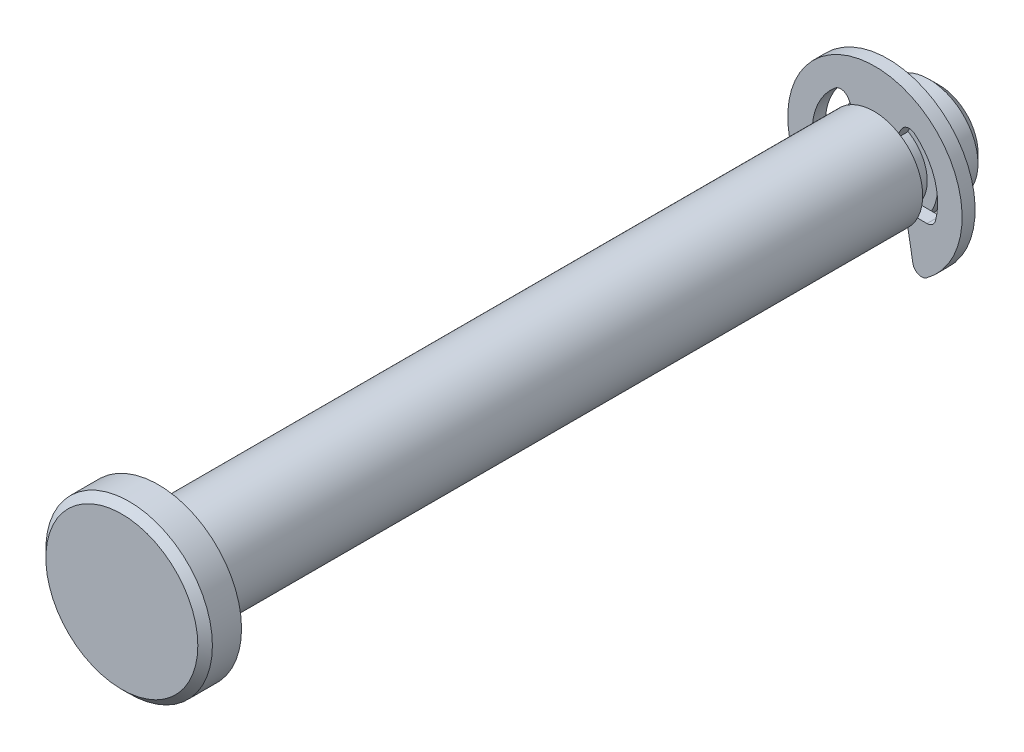
ISO-10303-21;
HEADER;
FILE_DESCRIPTION(('STEP AP214'),'2;1');
FILE_NAME('part.step','',(''),(''),'','','');
FILE_SCHEMA(('AUTOMOTIVE_DESIGN { 1 0 10303 214 1 1 1 1 }'));
ENDSEC;
DATA;
#1=APPLICATION_CONTEXT('core data for automotive mechanical design processes');
#2=APPLICATION_PROTOCOL_DEFINITION('international standard','automotive_design',2000,#1);
#3=PRODUCT_CONTEXT('',#1,'mechanical');
#4=PRODUCT('Part','Part','',(#3));
#5=PRODUCT_RELATED_PRODUCT_CATEGORY('part','',(#4));
#6=PRODUCT_DEFINITION_FORMATION('','',#4);
#7=PRODUCT_DEFINITION_CONTEXT('part definition',#1,'design');
#8=PRODUCT_DEFINITION('design','',#6,#7);
#9=PRODUCT_DEFINITION_SHAPE('','',#8);
#10=(LENGTH_UNIT() NAMED_UNIT(*) SI_UNIT(.MILLI.,.METRE.));
#11=(NAMED_UNIT(*) PLANE_ANGLE_UNIT() SI_UNIT($,.RADIAN.));
#12=(NAMED_UNIT(*) SI_UNIT($,.STERADIAN.) SOLID_ANGLE_UNIT());
#13=UNCERTAINTY_MEASURE_WITH_UNIT(LENGTH_MEASURE(1.E-05),#10,'distance_accuracy_value','');
#14=(GEOMETRIC_REPRESENTATION_CONTEXT(3) GLOBAL_UNCERTAINTY_ASSIGNED_CONTEXT((#13)) GLOBAL_UNIT_ASSIGNED_CONTEXT((#10,
#11,#12)) REPRESENTATION_CONTEXT('',''));
#15=CARTESIAN_POINT('',(0.,0.,0.));
#16=DIRECTION('',(0.,0.,1.));
#17=DIRECTION('',(1.,0.,0.));
#18=AXIS2_PLACEMENT_3D('',#15,#16,#17);
#19=CARTESIAN_POINT('',(0.,0.,-15.9258));
#20=DIRECTION('',(0.,0.,1.));
#21=DIRECTION('',(1.,0.,0.));
#22=AXIS2_PLACEMENT_3D('',#19,#20,#21);
#23=PLANE('',#22);
#24=DIRECTION('',(-0.173648177666931,0.984807753012208,0.));
#25=VECTOR('',#24,1.);
#26=CARTESIAN_POINT('',(1.25692963982568,0.22163060835344,-15.9258));
#27=LINE('',#26,#25);
#28=CARTESIAN_POINT('',(1.85256069501915,-3.15636096616503,-15.9258));
#29=VERTEX_POINT('',#28);
#30=CARTESIAN_POINT('',(1.49352,-1.12014,-15.9258));
#31=VERTEX_POINT('',#30);
#32=EDGE_CURVE('E195',#29,#31,#27,.T.);
#33=ORIENTED_EDGE('',*,*,#32,.F.);
#34=CARTESIAN_POINT('',(2.2715471535382,-3.08248234897663,-15.9258));
#35=DIRECTION('',(0.,0.,1.));
#36=DIRECTION('',(1.,0.,0.));
#37=AXIS2_PLACEMENT_3D('',#34,#35,#36);
#38=CIRCLE('',#37,0.42545);
#39=CARTESIAN_POINT('',(2.52394128170911,-3.42498038775182,-15.9258));
#40=VERTEX_POINT('',#39);
#41=EDGE_CURVE('E249',#29,#40,#38,.T.);
#42=ORIENTED_EDGE('',*,*,#41,.T.);
#43=CARTESIAN_POINT('',(0.,0.,-15.9258));
#44=DIRECTION('',(0.,0.,1.));
#45=DIRECTION('',(1.,0.,0.));
#46=AXIS2_PLACEMENT_3D('',#43,#44,#45);
#47=CIRCLE('',#46,4.2545);
#48=CARTESIAN_POINT('',(-2.52394128170911,-3.42498038775182,-15.9258));
#49=VERTEX_POINT('',#48);
#50=EDGE_CURVE('E175',#40,#49,#47,.T.);
#51=ORIENTED_EDGE('',*,*,#50,.T.);
#52=CARTESIAN_POINT('',(-2.2715471535382,-3.08248234897663,-15.9258));
#53=DIRECTION('',(0.,0.,1.));
#54=DIRECTION('',(1.,0.,0.));
#55=AXIS2_PLACEMENT_3D('',#52,#53,#54);
#56=CIRCLE('',#55,0.42545);
#57=CARTESIAN_POINT('',(-1.85256069501915,-3.15636096616503,-15.9258));
#58=VERTEX_POINT('',#57);
#59=EDGE_CURVE('E247',#49,#58,#56,.T.);
#60=ORIENTED_EDGE('',*,*,#59,.T.);
#61=DIRECTION('',(-0.173648177666931,-0.984807753012208,0.));
#62=VECTOR('',#61,1.);
#63=CARTESIAN_POINT('',(-1.25692963982568,0.22163060835344,-15.9258));
#64=LINE('',#63,#62);
#65=CARTESIAN_POINT('',(-1.49352,-1.12014,-15.9258));
#66=VERTEX_POINT('',#65);
#67=EDGE_CURVE('E191',#66,#58,#64,.T.);
#68=ORIENTED_EDGE('',*,*,#67,.F.);
#69=DIRECTION('',(1.,0.,0.));
#70=VECTOR('',#69,1.);
#71=CARTESIAN_POINT('',(0.,-1.12014,-15.9258));
#72=LINE('',#71,#70);
#73=CARTESIAN_POINT('',(-2.54203626378539,-1.12014,-15.9258));
#74=VERTEX_POINT('',#73);
#75=EDGE_CURVE('E182',#74,#66,#72,.T.);
#76=ORIENTED_EDGE('',*,*,#75,.F.);
#77=CARTESIAN_POINT('',(-2.54203626378539,-0.69469,-15.9258));
#78=DIRECTION('',(0.,0.,1.));
#79=DIRECTION('',(1.,0.,0.));
#80=AXIS2_PLACEMENT_3D('',#77,#78,#79);
#81=CIRCLE('',#80,0.42545);
#82=CARTESIAN_POINT('',(-2.95243729914352,-0.806844771084337,-15.9258));
#83=VERTEX_POINT('',#82);
#84=EDGE_CURVE('E47',#74,#83,#81,.F.);
#85=ORIENTED_EDGE('',*,*,#84,.T.);
#86=CARTESIAN_POINT('',(0.,0.,-15.9258));
#87=DIRECTION('',(0.,0.,1.));
#88=DIRECTION('',(1.,0.,0.));
#89=AXIS2_PLACEMENT_3D('',#86,#87,#88);
#90=CIRCLE('',#89,3.0607);
#91=CARTESIAN_POINT('',(-1.93820951958955,2.36880314677528,-15.9258));
#92=VERTEX_POINT('',#91);
#93=EDGE_CURVE('E207',#92,#83,#90,.T.);
#94=ORIENTED_EDGE('',*,*,#93,.F.);
#95=CARTESIAN_POINT('',(-1.66879035400345,2.03952968031481,-15.9258));
#96=DIRECTION('',(0.,0.,1.));
#97=DIRECTION('',(1.,0.,0.));
#98=AXIS2_PLACEMENT_3D('',#95,#96,#97);
#99=CIRCLE('',#98,0.42545);
#100=CARTESIAN_POINT('',(-1.30033984596336,2.25225468031482,-15.9258));
#101=VERTEX_POINT('',#100);
#102=EDGE_CURVE('E179',#92,#101,#99,.F.);
#103=ORIENTED_EDGE('',*,*,#102,.T.);
#104=DIRECTION('',(-0.500000000000002,0.866025403784438,0.));
#105=VECTOR('',#104,1.);
#106=CARTESIAN_POINT('',(0.,0.,-15.9258));
#107=LINE('',#106,#105);
#108=CARTESIAN_POINT('',(-0.933450000000003,1.61678282632517,-15.9258));
#109=VERTEX_POINT('',#108);
#110=EDGE_CURVE('E171',#109,#101,#107,.T.);
#111=ORIENTED_EDGE('',*,*,#110,.F.);
#112=DIRECTION('',(1.,0.,0.));
#113=VECTOR('',#112,1.);
#114=CARTESIAN_POINT('',(-0.933450000000003,1.61678282632517,-15.9258));
#115=LINE('',#114,#113);
#116=CARTESIAN_POINT('',(0.933450000000003,1.61678282632517,-15.9258));
#117=VERTEX_POINT('',#116);
#118=EDGE_CURVE('E155',#109,#117,#115,.T.);
#119=ORIENTED_EDGE('',*,*,#118,.T.);
#120=DIRECTION('',(-0.500000000000002,-0.866025403784438,0.));
#121=VECTOR('',#120,1.);
#122=CARTESIAN_POINT('',(0.,0.,-15.9258));
#123=LINE('',#122,#121);
#124=CARTESIAN_POINT('',(1.30033984596336,2.25225468031482,-15.9258));
#125=VERTEX_POINT('',#124);
#126=EDGE_CURVE('E205',#125,#117,#123,.T.);
#127=ORIENTED_EDGE('',*,*,#126,.F.);
#128=CARTESIAN_POINT('',(1.66879035400345,2.03952968031481,-15.9258));
#129=DIRECTION('',(0.,0.,1.));
#130=DIRECTION('',(1.,0.,0.));
#131=AXIS2_PLACEMENT_3D('',#128,#129,#130);
#132=CIRCLE('',#131,0.42545);
#133=CARTESIAN_POINT('',(1.93820951958955,2.36880314677528,-15.9258));
#134=VERTEX_POINT('',#133);
#135=EDGE_CURVE('E264',#125,#134,#132,.F.);
#136=ORIENTED_EDGE('',*,*,#135,.T.);
#137=CARTESIAN_POINT('',(0.,0.,-15.9258));
#138=DIRECTION('',(0.,0.,1.));
#139=DIRECTION('',(1.,0.,0.));
#140=AXIS2_PLACEMENT_3D('',#137,#138,#139);
#141=CIRCLE('',#140,3.0607);
#142=CARTESIAN_POINT('',(2.95243729914352,-0.806844771084337,-15.9258));
#143=VERTEX_POINT('',#142);
#144=EDGE_CURVE('E210',#143,#134,#141,.T.);
#145=ORIENTED_EDGE('',*,*,#144,.F.);
#146=CARTESIAN_POINT('',(2.54203626378539,-0.69469,-15.9258));
#147=DIRECTION('',(0.,0.,1.));
#148=DIRECTION('',(1.,0.,0.));
#149=AXIS2_PLACEMENT_3D('',#146,#147,#148);
#150=CIRCLE('',#149,0.42545);
#151=CARTESIAN_POINT('',(2.54203626378539,-1.12014,-15.9258));
#152=VERTEX_POINT('',#151);
#153=EDGE_CURVE('E260',#143,#152,#150,.F.);
#154=ORIENTED_EDGE('',*,*,#153,.T.);
#155=DIRECTION('',(1.,0.,0.));
#156=VECTOR('',#155,1.);
#157=CARTESIAN_POINT('',(0.,-1.12014,-15.9258));
#158=LINE('',#157,#156);
#159=EDGE_CURVE('E200',#31,#152,#158,.T.);
#160=ORIENTED_EDGE('',*,*,#159,.F.);
#161=EDGE_LOOP('',(#33,#42,#51,#60,#68,#76,#85,#94,#103,#111,#119,#127,#136,#145,#154,#160));
#162=FACE_BOUND('',#161,.T.);
#163=ADVANCED_FACE('F39',(#162),#23,.T.);
#164=CARTESIAN_POINT('',(0.,0.,-16.5608));
#165=DIRECTION('',(0.,0.,1.));
#166=DIRECTION('',(1.,0.,0.));
#167=AXIS2_PLACEMENT_3D('',#164,#165,#166);
#168=PLANE('',#167);
#169=CARTESIAN_POINT('',(0.,0.,-16.5608));
#170=DIRECTION('',(0.,0.,1.));
#171=DIRECTION('',(1.,0.,0.));
#172=AXIS2_PLACEMENT_3D('',#169,#170,#171);
#173=CIRCLE('',#172,4.2545);
#174=CARTESIAN_POINT('',(2.52394128170911,-3.42498038775182,-16.5608));
#175=VERTEX_POINT('',#174);
#176=CARTESIAN_POINT('',(-2.52394128170911,-3.42498038775182,-16.5608));
#177=VERTEX_POINT('',#176);
#178=EDGE_CURVE('E213',#175,#177,#173,.T.);
#179=ORIENTED_EDGE('',*,*,#178,.F.);
#180=CARTESIAN_POINT('',(2.2715471535382,-3.08248234897663,-16.5608));
#181=DIRECTION('',(0.,0.,1.));
#182=DIRECTION('',(1.,0.,0.));
#183=AXIS2_PLACEMENT_3D('',#180,#181,#182);
#184=CIRCLE('',#183,0.42545);
#185=CARTESIAN_POINT('',(1.85256069501915,-3.15636096616503,-16.5608));
#186=VERTEX_POINT('',#185);
#187=EDGE_CURVE('E257',#175,#186,#184,.F.);
#188=ORIENTED_EDGE('',*,*,#187,.T.);
#189=DIRECTION('',(-0.173648177666931,0.984807753012208,0.));
#190=VECTOR('',#189,1.);
#191=CARTESIAN_POINT('',(1.25692963982568,0.22163060835344,-16.5608));
#192=LINE('',#191,#190);
#193=CARTESIAN_POINT('',(1.49352,-1.12014,-16.5608));
#194=VERTEX_POINT('',#193);
#195=EDGE_CURVE('E193',#186,#194,#192,.T.);
#196=ORIENTED_EDGE('',*,*,#195,.T.);
#197=DIRECTION('',(1.,0.,0.));
#198=VECTOR('',#197,1.);
#199=CARTESIAN_POINT('',(0.,-1.12014,-16.5608));
#200=LINE('',#199,#198);
#201=CARTESIAN_POINT('',(2.54203626378539,-1.12014,-16.5608));
#202=VERTEX_POINT('',#201);
#203=EDGE_CURVE('E197',#194,#202,#200,.T.);
#204=ORIENTED_EDGE('',*,*,#203,.T.);
#205=CARTESIAN_POINT('',(2.54203626378539,-0.69469,-16.5608));
#206=DIRECTION('',(0.,0.,1.));
#207=DIRECTION('',(1.,0.,0.));
#208=AXIS2_PLACEMENT_3D('',#205,#206,#207);
#209=CIRCLE('',#208,0.42545);
#210=CARTESIAN_POINT('',(2.95243729914352,-0.806844771084337,-16.5608));
#211=VERTEX_POINT('',#210);
#212=EDGE_CURVE('E262',#202,#211,#209,.T.);
#213=ORIENTED_EDGE('',*,*,#212,.T.);
#214=CARTESIAN_POINT('',(0.,0.,-16.5608));
#215=DIRECTION('',(0.,0.,1.));
#216=DIRECTION('',(1.,0.,0.));
#217=AXIS2_PLACEMENT_3D('',#214,#215,#216);
#218=CIRCLE('',#217,3.0607);
#219=CARTESIAN_POINT('',(1.93820951958955,2.36880314677528,-16.5608));
#220=VERTEX_POINT('',#219);
#221=EDGE_CURVE('E221',#211,#220,#218,.T.);
#222=ORIENTED_EDGE('',*,*,#221,.T.);
#223=CARTESIAN_POINT('',(1.66879035400345,2.03952968031481,-16.5608));
#224=DIRECTION('',(0.,0.,1.));
#225=DIRECTION('',(1.,0.,0.));
#226=AXIS2_PLACEMENT_3D('',#223,#224,#225);
#227=CIRCLE('',#226,0.42545);
#228=CARTESIAN_POINT('',(1.30033984596336,2.25225468031482,-16.5608));
#229=VERTEX_POINT('',#228);
#230=EDGE_CURVE('E266',#220,#229,#227,.T.);
#231=ORIENTED_EDGE('',*,*,#230,.T.);
#232=DIRECTION('',(-0.500000000000002,-0.866025403784438,0.));
#233=VECTOR('',#232,1.);
#234=CARTESIAN_POINT('',(0.,0.,-16.5608));
#235=LINE('',#234,#233);
#236=CARTESIAN_POINT('',(0.933450000000003,1.61678282632517,-16.5608));
#237=VERTEX_POINT('',#236);
#238=EDGE_CURVE('E203',#229,#237,#235,.T.);
#239=ORIENTED_EDGE('',*,*,#238,.T.);
#240=DIRECTION('',(-1.,0.,0.));
#241=VECTOR('',#240,1.);
#242=CARTESIAN_POINT('',(-0.933450000000003,1.61678282632517,-16.5608));
#243=LINE('',#242,#241);
#244=CARTESIAN_POINT('',(-0.933450000000003,1.61678282632517,-16.5608));
#245=VERTEX_POINT('',#244);
#246=EDGE_CURVE('E166',#237,#245,#243,.T.);
#247=ORIENTED_EDGE('',*,*,#246,.T.);
#248=DIRECTION('',(-0.500000000000002,0.866025403784438,0.));
#249=VECTOR('',#248,1.);
#250=CARTESIAN_POINT('',(0.,0.,-16.5608));
#251=LINE('',#250,#249);
#252=CARTESIAN_POINT('',(-1.30033984596336,2.25225468031482,-16.5608));
#253=VERTEX_POINT('',#252);
#254=EDGE_CURVE('E174',#245,#253,#251,.T.);
#255=ORIENTED_EDGE('',*,*,#254,.T.);
#256=CARTESIAN_POINT('',(-1.66879035400345,2.03952968031481,-16.5608));
#257=DIRECTION('',(0.,0.,1.));
#258=DIRECTION('',(1.,0.,0.));
#259=AXIS2_PLACEMENT_3D('',#256,#257,#258);
#260=CIRCLE('',#259,0.42545);
#261=CARTESIAN_POINT('',(-1.93820951958955,2.36880314677528,-16.5608));
#262=VERTEX_POINT('',#261);
#263=EDGE_CURVE('E269',#253,#262,#260,.T.);
#264=ORIENTED_EDGE('',*,*,#263,.T.);
#265=CARTESIAN_POINT('',(0.,0.,-16.5608));
#266=DIRECTION('',(0.,0.,1.));
#267=DIRECTION('',(1.,0.,0.));
#268=AXIS2_PLACEMENT_3D('',#265,#266,#267);
#269=CIRCLE('',#268,3.0607);
#270=CARTESIAN_POINT('',(-2.95243729914352,-0.806844771084337,-16.5608));
#271=VERTEX_POINT('',#270);
#272=EDGE_CURVE('E218',#262,#271,#269,.T.);
#273=ORIENTED_EDGE('',*,*,#272,.T.);
#274=CARTESIAN_POINT('',(-2.54203626378539,-0.69469,-16.5608));
#275=DIRECTION('',(0.,0.,1.));
#276=DIRECTION('',(1.,0.,0.));
#277=AXIS2_PLACEMENT_3D('',#274,#275,#276);
#278=CIRCLE('',#277,0.42545);
#279=CARTESIAN_POINT('',(-2.54203626378539,-1.12014,-16.5608));
#280=VERTEX_POINT('',#279);
#281=EDGE_CURVE('E12',#271,#280,#278,.T.);
#282=ORIENTED_EDGE('',*,*,#281,.T.);
#283=DIRECTION('',(1.,0.,0.));
#284=VECTOR('',#283,1.);
#285=CARTESIAN_POINT('',(0.,-1.12014,-16.5608));
#286=LINE('',#285,#284);
#287=CARTESIAN_POINT('',(-1.49352,-1.12014,-16.5608));
#288=VERTEX_POINT('',#287);
#289=EDGE_CURVE('E180',#280,#288,#286,.T.);
#290=ORIENTED_EDGE('',*,*,#289,.T.);
#291=DIRECTION('',(-0.173648177666931,-0.984807753012208,0.));
#292=VECTOR('',#291,1.);
#293=CARTESIAN_POINT('',(-1.25692963982568,0.22163060835344,-16.5608));
#294=LINE('',#293,#292);
#295=CARTESIAN_POINT('',(-1.85256069501915,-3.15636096616503,-16.5608));
#296=VERTEX_POINT('',#295);
#297=EDGE_CURVE('E189',#288,#296,#294,.T.);
#298=ORIENTED_EDGE('',*,*,#297,.T.);
#299=CARTESIAN_POINT('',(-2.2715471535382,-3.08248234897663,-16.5608));
#300=DIRECTION('',(0.,0.,1.));
#301=DIRECTION('',(1.,0.,0.));
#302=AXIS2_PLACEMENT_3D('',#299,#300,#301);
#303=CIRCLE('',#302,0.42545);
#304=EDGE_CURVE('E61',#296,#177,#303,.F.);
#305=ORIENTED_EDGE('',*,*,#304,.T.);
#306=EDGE_LOOP('',(#179,#188,#196,#204,#213,#222,#231,#239,#247,#255,#264,#273,#282,#290,#298,#305));
#307=FACE_BOUND('',#306,.T.);
#308=ADVANCED_FACE('F282',(#307),#168,.F.);
#309=CARTESIAN_POINT('',(0.,0.,-15.9258));
#310=DIRECTION('',(0.,0.,-1.));
#311=DIRECTION('',(-1.,0.,0.));
#312=AXIS2_PLACEMENT_3D('',#309,#310,#311);
#313=CYLINDRICAL_SURFACE('',#312,4.2545);
#314=ORIENTED_EDGE('',*,*,#50,.F.);
#315=DIRECTION('',(0.,0.,-1.));
#316=VECTOR('',#315,1.);
#317=CARTESIAN_POINT('',(2.52394128170911,-3.42498038775182,-15.9258));
#318=LINE('',#317,#316);
#319=EDGE_CURVE('E254',#40,#175,#318,.T.);
#320=ORIENTED_EDGE('',*,*,#319,.T.);
#321=ORIENTED_EDGE('',*,*,#178,.T.);
#322=DIRECTION('',(0.,0.,-1.));
#323=VECTOR('',#322,1.);
#324=CARTESIAN_POINT('',(-2.52394128170911,-3.42498038775182,-15.9258));
#325=LINE('',#324,#323);
#326=EDGE_CURVE('E251',#177,#49,#325,.F.);
#327=ORIENTED_EDGE('',*,*,#326,.T.);
#328=EDGE_LOOP('',(#314,#320,#321,#327));
#329=FACE_BOUND('',#328,.T.);
#330=ADVANCED_FACE('F322',(#329),#313,.T.);
#331=CARTESIAN_POINT('',(-1.49352,-1.12014,-19.05));
#332=DIRECTION('',(-0.984807753012208,0.173648177666931,0.));
#333=DIRECTION('',(-0.173648177666931,-0.984807753012208,0.));
#334=AXIS2_PLACEMENT_3D('',#331,#332,#333);
#335=PLANE('',#334);
#336=ORIENTED_EDGE('',*,*,#67,.T.);
#337=DIRECTION('',(0.,0.,-1.));
#338=VECTOR('',#337,1.);
#339=CARTESIAN_POINT('',(-1.85256069501915,-3.15636096616503,-19.05));
#340=LINE('',#339,#338);
#341=EDGE_CURVE('E54',#58,#296,#340,.T.);
#342=ORIENTED_EDGE('',*,*,#341,.T.);
#343=ORIENTED_EDGE('',*,*,#297,.F.);
#344=DIRECTION('',(0.,0.,1.));
#345=VECTOR('',#344,1.);
#346=CARTESIAN_POINT('',(-1.49352,-1.12014,-19.05));
#347=LINE('',#346,#345);
#348=EDGE_CURVE('E287',#288,#66,#347,.T.);
#349=ORIENTED_EDGE('',*,*,#348,.T.);
#350=EDGE_LOOP('',(#336,#342,#343,#349));
#351=FACE_BOUND('',#350,.T.);
#352=ADVANCED_FACE('F327',(#351),#335,.F.);
#353=CARTESIAN_POINT('',(-1.53035,2.65064395336303,-19.05));
#354=DIRECTION('',(0.866025403784438,0.500000000000002,0.));
#355=DIRECTION('',(-0.500000000000002,0.866025403784438,0.));
#356=AXIS2_PLACEMENT_3D('',#353,#354,#355);
#357=PLANE('',#356);
#358=ORIENTED_EDGE('',*,*,#110,.T.);
#359=DIRECTION('',(0.,0.,-1.));
#360=VECTOR('',#359,1.);
#361=CARTESIAN_POINT('',(-1.30033984596336,2.25225468031481,-16.5608));
#362=LINE('',#361,#360);
#363=EDGE_CURVE('E239',#101,#253,#362,.T.);
#364=ORIENTED_EDGE('',*,*,#363,.T.);
#365=ORIENTED_EDGE('',*,*,#254,.F.);
#366=DIRECTION('',(0.,0.,-1.));
#367=VECTOR('',#366,1.);
#368=CARTESIAN_POINT('',(-0.933450000000003,1.61678282632517,-15.9258));
#369=LINE('',#368,#367);
#370=EDGE_CURVE('E159',#245,#109,#369,.F.);
#371=ORIENTED_EDGE('',*,*,#370,.T.);
#372=EDGE_LOOP('',(#358,#364,#365,#371));
#373=FACE_BOUND('',#372,.T.);
#374=ADVANCED_FACE('F170',(#373),#357,.F.);
#375=CARTESIAN_POINT('',(0.,0.,-19.05));
#376=DIRECTION('',(0.,0.,1.));
#377=DIRECTION('',(1.,0.,0.));
#378=AXIS2_PLACEMENT_3D('',#375,#376,#377);
#379=CYLINDRICAL_SURFACE('',#378,3.0607);
#380=ORIENTED_EDGE('',*,*,#272,.F.);
#381=DIRECTION('',(0.,0.,1.));
#382=VECTOR('',#381,1.);
#383=CARTESIAN_POINT('',(-1.93820951958955,2.36880314677528,-19.05));
#384=LINE('',#383,#382);
#385=EDGE_CURVE('E236',#262,#92,#384,.T.);
#386=ORIENTED_EDGE('',*,*,#385,.T.);
#387=ORIENTED_EDGE('',*,*,#93,.T.);
#388=DIRECTION('',(0.,0.,1.));
#389=VECTOR('',#388,1.);
#390=CARTESIAN_POINT('',(-2.95243729914352,-0.806844771084337,-19.05));
#391=LINE('',#390,#389);
#392=EDGE_CURVE('E234',#83,#271,#391,.F.);
#393=ORIENTED_EDGE('',*,*,#392,.T.);
#394=EDGE_LOOP('',(#380,#386,#387,#393));
#395=FACE_BOUND('',#394,.T.);
#396=ADVANCED_FACE('F277',(#395),#379,.F.);
#397=CARTESIAN_POINT('',(-2.84836284036989,-1.12014,-19.05));
#398=DIRECTION('',(0.,-1.,0.));
#399=DIRECTION('',(0.,0.,-1.));
#400=AXIS2_PLACEMENT_3D('',#397,#398,#399);
#401=PLANE('',#400);
#402=ORIENTED_EDGE('',*,*,#289,.F.);
#403=DIRECTION('',(0.,0.,-1.));
#404=VECTOR('',#403,1.);
#405=CARTESIAN_POINT('',(-2.54203626378539,-1.12014,-15.9258));
#406=LINE('',#405,#404);
#407=EDGE_CURVE('E241',#280,#74,#406,.F.);
#408=ORIENTED_EDGE('',*,*,#407,.T.);
#409=ORIENTED_EDGE('',*,*,#75,.T.);
#410=ORIENTED_EDGE('',*,*,#348,.F.);
#411=EDGE_LOOP('',(#402,#408,#409,#410));
#412=FACE_BOUND('',#411,.T.);
#413=ADVANCED_FACE('F285',(#412),#401,.F.);
#414=CARTESIAN_POINT('',(0.,0.,-19.05));
#415=DIRECTION('',(0.,0.,1.));
#416=DIRECTION('',(1.,0.,0.));
#417=AXIS2_PLACEMENT_3D('',#414,#415,#416);
#418=CYLINDRICAL_SURFACE('',#417,3.0607);
#419=ORIENTED_EDGE('',*,*,#221,.F.);
#420=DIRECTION('',(0.,0.,1.));
#421=VECTOR('',#420,1.);
#422=CARTESIAN_POINT('',(2.95243729914352,-0.806844771084337,-19.05));
#423=LINE('',#422,#421);
#424=EDGE_CURVE('E226',#211,#143,#423,.T.);
#425=ORIENTED_EDGE('',*,*,#424,.T.);
#426=ORIENTED_EDGE('',*,*,#144,.T.);
#427=DIRECTION('',(0.,0.,1.));
#428=VECTOR('',#427,1.);
#429=CARTESIAN_POINT('',(1.93820951958955,2.36880314677528,-19.05));
#430=LINE('',#429,#428);
#431=EDGE_CURVE('E224',#134,#220,#430,.F.);
#432=ORIENTED_EDGE('',*,*,#431,.T.);
#433=EDGE_LOOP('',(#419,#425,#426,#432));
#434=FACE_BOUND('',#433,.T.);
#435=ADVANCED_FACE('F301',(#434),#418,.F.);
#436=CARTESIAN_POINT('',(1.49352,-1.12014,-19.05));
#437=DIRECTION('',(0.,-1.,0.));
#438=DIRECTION('',(0.,0.,-1.));
#439=AXIS2_PLACEMENT_3D('',#436,#437,#438);
#440=PLANE('',#439);
#441=ORIENTED_EDGE('',*,*,#159,.T.);
#442=DIRECTION('',(0.,0.,-1.));
#443=VECTOR('',#442,1.);
#444=CARTESIAN_POINT('',(2.54203626378539,-1.12014,-16.5608));
#445=LINE('',#444,#443);
#446=EDGE_CURVE('E229',#152,#202,#445,.T.);
#447=ORIENTED_EDGE('',*,*,#446,.T.);
#448=ORIENTED_EDGE('',*,*,#203,.F.);
#449=DIRECTION('',(0.,0.,1.));
#450=VECTOR('',#449,1.);
#451=CARTESIAN_POINT('',(1.49352,-1.12014,-19.05));
#452=LINE('',#451,#450);
#453=EDGE_CURVE('E184',#194,#31,#452,.T.);
#454=ORIENTED_EDGE('',*,*,#453,.T.);
#455=EDGE_LOOP('',(#441,#447,#448,#454));
#456=FACE_BOUND('',#455,.T.);
#457=ADVANCED_FACE('F311',(#456),#440,.F.);
#458=CARTESIAN_POINT('',(1.49352,-1.12014,-19.05));
#459=DIRECTION('',(0.984807753012208,0.173648177666931,0.));
#460=DIRECTION('',(-0.173648177666931,0.984807753012208,0.));
#461=AXIS2_PLACEMENT_3D('',#458,#459,#460);
#462=PLANE('',#461);
#463=ORIENTED_EDGE('',*,*,#195,.F.);
#464=DIRECTION('',(0.,0.,-1.));
#465=VECTOR('',#464,1.);
#466=CARTESIAN_POINT('',(1.85256069501915,-3.15636096616503,-19.05));
#467=LINE('',#466,#465);
#468=EDGE_CURVE('E244',#186,#29,#467,.F.);
#469=ORIENTED_EDGE('',*,*,#468,.T.);
#470=ORIENTED_EDGE('',*,*,#32,.T.);
#471=ORIENTED_EDGE('',*,*,#453,.F.);
#472=EDGE_LOOP('',(#463,#469,#470,#471));
#473=FACE_BOUND('',#472,.T.);
#474=ADVANCED_FACE('F316',(#473),#462,.F.);
#475=CARTESIAN_POINT('',(0.,0.,-19.05));
#476=DIRECTION('',(-0.866025403784438,0.500000000000002,0.));
#477=DIRECTION('',(-0.500000000000002,-0.866025403784438,0.));
#478=AXIS2_PLACEMENT_3D('',#475,#476,#477);
#479=PLANE('',#478);
#480=ORIENTED_EDGE('',*,*,#238,.F.);
#481=DIRECTION('',(0.,0.,-1.));
#482=VECTOR('',#481,1.);
#483=CARTESIAN_POINT('',(1.30033984596336,2.25225468031481,-15.9258));
#484=LINE('',#483,#482);
#485=EDGE_CURVE('E231',#229,#125,#484,.F.);
#486=ORIENTED_EDGE('',*,*,#485,.T.);
#487=ORIENTED_EDGE('',*,*,#126,.T.);
#488=DIRECTION('',(0.,0.,-1.));
#489=VECTOR('',#488,1.);
#490=CARTESIAN_POINT('',(0.933450000000003,1.61678282632517,-15.9258));
#491=LINE('',#490,#489);
#492=EDGE_CURVE('E162',#117,#237,#491,.T.);
#493=ORIENTED_EDGE('',*,*,#492,.T.);
#494=EDGE_LOOP('',(#480,#486,#487,#493));
#495=FACE_BOUND('',#494,.T.);
#496=ADVANCED_FACE('F294',(#495),#479,.F.);
#497=CARTESIAN_POINT('',(-0.933450000000003,1.61678282632517,-18.4443801577228));
#498=DIRECTION('',(0.,-1.,0.));
#499=DIRECTION('',(0.,0.,-1.));
#500=AXIS2_PLACEMENT_3D('',#497,#498,#499);
#501=PLANE('',#500);
#502=ORIENTED_EDGE('',*,*,#246,.F.);
#503=ORIENTED_EDGE('',*,*,#492,.F.);
#504=ORIENTED_EDGE('',*,*,#118,.F.);
#505=ORIENTED_EDGE('',*,*,#370,.F.);
#506=EDGE_LOOP('',(#502,#503,#504,#505));
#507=FACE_BOUND('',#506,.T.);
#508=ADVANCED_FACE('F158',(#507),#501,.T.);
#509=CARTESIAN_POINT('',(2.54203626378539,-0.69469,-19.05));
#510=DIRECTION('',(0.,0.,1.));
#511=DIRECTION('',(1.,0.,0.));
#512=AXIS2_PLACEMENT_3D('',#509,#510,#511);
#513=CYLINDRICAL_SURFACE('',#512,0.42545);
#514=ORIENTED_EDGE('',*,*,#212,.F.);
#515=ORIENTED_EDGE('',*,*,#446,.F.);
#516=ORIENTED_EDGE('',*,*,#153,.F.);
#517=ORIENTED_EDGE('',*,*,#424,.F.);
#518=EDGE_LOOP('',(#514,#515,#516,#517));
#519=FACE_BOUND('',#518,.T.);
#520=ADVANCED_FACE('F307',(#519),#513,.F.);
#521=CARTESIAN_POINT('',(1.66879035400345,2.03952968031481,-19.05));
#522=DIRECTION('',(0.,0.,1.));
#523=DIRECTION('',(1.,0.,0.));
#524=AXIS2_PLACEMENT_3D('',#521,#522,#523);
#525=CYLINDRICAL_SURFACE('',#524,0.42545);
#526=ORIENTED_EDGE('',*,*,#230,.F.);
#527=ORIENTED_EDGE('',*,*,#431,.F.);
#528=ORIENTED_EDGE('',*,*,#135,.F.);
#529=ORIENTED_EDGE('',*,*,#485,.F.);
#530=EDGE_LOOP('',(#526,#527,#528,#529));
#531=FACE_BOUND('',#530,.T.);
#532=ADVANCED_FACE('F304',(#531),#525,.F.);
#533=CARTESIAN_POINT('',(-1.66879035400345,2.03952968031481,-19.05));
#534=DIRECTION('',(0.,0.,1.));
#535=DIRECTION('',(1.,0.,0.));
#536=AXIS2_PLACEMENT_3D('',#533,#534,#535);
#537=CYLINDRICAL_SURFACE('',#536,0.42545);
#538=ORIENTED_EDGE('',*,*,#263,.F.);
#539=ORIENTED_EDGE('',*,*,#363,.F.);
#540=ORIENTED_EDGE('',*,*,#102,.F.);
#541=ORIENTED_EDGE('',*,*,#385,.F.);
#542=EDGE_LOOP('',(#538,#539,#540,#541));
#543=FACE_BOUND('',#542,.T.);
#544=ADVANCED_FACE('F350',(#543),#537,.F.);
#545=CARTESIAN_POINT('',(-2.54203626378539,-0.69469,-19.05));
#546=DIRECTION('',(0.,0.,1.));
#547=DIRECTION('',(1.,0.,0.));
#548=AXIS2_PLACEMENT_3D('',#545,#546,#547);
#549=CYLINDRICAL_SURFACE('',#548,0.42545);
#550=ORIENTED_EDGE('',*,*,#281,.F.);
#551=ORIENTED_EDGE('',*,*,#392,.F.);
#552=ORIENTED_EDGE('',*,*,#84,.F.);
#553=ORIENTED_EDGE('',*,*,#407,.F.);
#554=EDGE_LOOP('',(#550,#551,#552,#553));
#555=FACE_BOUND('',#554,.T.);
#556=ADVANCED_FACE('F280',(#555),#549,.F.);
#557=CARTESIAN_POINT('',(2.2715471535382,-3.08248234897663,-15.9258));
#558=DIRECTION('',(0.,0.,-1.));
#559=DIRECTION('',(-1.,0.,0.));
#560=AXIS2_PLACEMENT_3D('',#557,#558,#559);
#561=CYLINDRICAL_SURFACE('',#560,0.42545);
#562=ORIENTED_EDGE('',*,*,#187,.F.);
#563=ORIENTED_EDGE('',*,*,#319,.F.);
#564=ORIENTED_EDGE('',*,*,#41,.F.);
#565=ORIENTED_EDGE('',*,*,#468,.F.);
#566=EDGE_LOOP('',(#562,#563,#564,#565));
#567=FACE_BOUND('',#566,.T.);
#568=ADVANCED_FACE('F325',(#567),#561,.T.);
#569=CARTESIAN_POINT('',(-2.2715471535382,-3.08248234897663,-15.9258));
#570=DIRECTION('',(0.,0.,-1.));
#571=DIRECTION('',(-1.,0.,0.));
#572=AXIS2_PLACEMENT_3D('',#569,#570,#571);
#573=CYLINDRICAL_SURFACE('',#572,0.42545);
#574=ORIENTED_EDGE('',*,*,#304,.F.);
#575=ORIENTED_EDGE('',*,*,#341,.F.);
#576=ORIENTED_EDGE('',*,*,#59,.F.);
#577=ORIENTED_EDGE('',*,*,#326,.F.);
#578=EDGE_LOOP('',(#574,#575,#576,#577));
#579=FACE_BOUND('',#578,.T.);
#580=ADVANCED_FACE('F41',(#579),#573,.T.);
#581=CLOSED_SHELL('',(#163,#308,#330,#352,#374,#396,#413,#435,#457,#474,#496,#508,#520,#532,
#544,#556,#568,#580));
#582=MANIFOLD_SOLID_BREP('B2',#581);
#583=CARTESIAN_POINT('',(0.,0.,19.05));
#584=DIRECTION('',(0.,0.,-1.));
#585=DIRECTION('',(-1.,0.,0.));
#586=AXIS2_PLACEMENT_3D('',#583,#584,#585);
#587=CYLINDRICAL_SURFACE('',#586,2.38125);
#588=CARTESIAN_POINT('',(0.,0.,19.05));
#589=DIRECTION('',(0.,0.,1.));
#590=DIRECTION('',(1.,0.,0.));
#591=AXIS2_PLACEMENT_3D('',#588,#589,#590);
#592=CIRCLE('',#591,2.38125);
#593=CARTESIAN_POINT('',(-2.38125,0.,19.05));
#594=VERTEX_POINT('',#593);
#595=EDGE_CURVE('E501',#594,#594,#592,.T.);
#596=CARTESIAN_POINT('',(0.,0.,-15.875));
#597=DIRECTION('',(0.,0.,1.));
#598=DIRECTION('',(1.,0.,0.));
#599=AXIS2_PLACEMENT_3D('',#596,#597,#598);
#600=CIRCLE('',#599,2.38125);
#601=CARTESIAN_POINT('',(-2.38125,0.,-15.875));
#602=VERTEX_POINT('',#601);
#603=EDGE_CURVE('E513',#602,#602,#600,.T.);
#604=CARTESIAN_POINT('',(-2.38125,0.,19.05));
#605=CARTESIAN_POINT('',(-2.38125,0.,18.6861979166667));
#606=CARTESIAN_POINT('',(-2.38125,0.,18.3223958333333));
#607=CARTESIAN_POINT('',(-2.38125,0.,17.5947916666667));
#608=CARTESIAN_POINT('',(-2.38125,0.,17.2309895833333));
#609=CARTESIAN_POINT('',(-2.38125,0.,16.5033854166667));
#610=CARTESIAN_POINT('',(-2.38125,0.,16.1395833333333));
#611=CARTESIAN_POINT('',(-2.38125,0.,15.4119791666667));
#612=CARTESIAN_POINT('',(-2.38125,0.,15.0481770833333));
#613=CARTESIAN_POINT('',(-2.38125,0.,14.3205729166667));
#614=CARTESIAN_POINT('',(-2.38125,0.,13.9567708333333));
#615=CARTESIAN_POINT('',(-2.38125,0.,13.2291666666667));
#616=CARTESIAN_POINT('',(-2.38125,0.,12.8653645833333));
#617=CARTESIAN_POINT('',(-2.38125,0.,12.1377604166667));
#618=CARTESIAN_POINT('',(-2.38125,0.,11.7739583333333));
#619=CARTESIAN_POINT('',(-2.38125,0.,11.0463541666667));
#620=CARTESIAN_POINT('',(-2.38125,0.,10.6825520833333));
#621=CARTESIAN_POINT('',(-2.38125,0.,9.95494791666667));
#622=CARTESIAN_POINT('',(-2.38125,0.,9.59114583333333));
#623=CARTESIAN_POINT('',(-2.38125,0.,8.86354166666666));
#624=CARTESIAN_POINT('',(-2.38125,0.,8.49973958333333));
#625=CARTESIAN_POINT('',(-2.38125,0.,7.77213541666666));
#626=CARTESIAN_POINT('',(-2.38125,0.,7.40833333333333));
#627=CARTESIAN_POINT('',(-2.38125,0.,6.68072916666666));
#628=CARTESIAN_POINT('',(-2.38125,0.,6.31692708333333));
#629=CARTESIAN_POINT('',(-2.38125,0.,5.58932291666666));
#630=CARTESIAN_POINT('',(-2.38125,0.,5.22552083333333));
#631=CARTESIAN_POINT('',(-2.38125,0.,4.49791666666666));
#632=CARTESIAN_POINT('',(-2.38125,0.,4.13411458333333));
#633=CARTESIAN_POINT('',(-2.38125,0.,3.40651041666666));
#634=CARTESIAN_POINT('',(-2.38125,0.,3.04270833333333));
#635=CARTESIAN_POINT('',(-2.38125,0.,2.31510416666666));
#636=CARTESIAN_POINT('',(-2.38125,0.,1.95130208333333));
#637=CARTESIAN_POINT('',(-2.38125,0.,1.22369791666666));
#638=CARTESIAN_POINT('',(-2.38125,0.,0.859895833333329));
#639=CARTESIAN_POINT('',(-2.38125,0.,0.132291666666663));
#640=CARTESIAN_POINT('',(-2.38125,0.,-0.231510416666671));
#641=CARTESIAN_POINT('',(-2.38125,0.,-0.959114583333338));
#642=CARTESIAN_POINT('',(-2.38125,0.,-1.32291666666667));
#643=CARTESIAN_POINT('',(-2.38125,0.,-2.05052083333334));
#644=CARTESIAN_POINT('',(-2.38125,0.,-2.41432291666667));
#645=CARTESIAN_POINT('',(-2.38125,0.,-3.14192708333334));
#646=CARTESIAN_POINT('',(-2.38125,0.,-3.50572916666667));
#647=CARTESIAN_POINT('',(-2.38125,0.,-4.23333333333334));
#648=CARTESIAN_POINT('',(-2.38125,0.,-4.59713541666668));
#649=CARTESIAN_POINT('',(-2.38125,0.,-5.32473958333334));
#650=CARTESIAN_POINT('',(-2.38125,0.,-5.68854166666668));
#651=CARTESIAN_POINT('',(-2.38125,0.,-6.41614583333334));
#652=CARTESIAN_POINT('',(-2.38125,0.,-6.77994791666667));
#653=CARTESIAN_POINT('',(-2.38125,0.,-7.50755208333334));
#654=CARTESIAN_POINT('',(-2.38125,0.,-7.87135416666667));
#655=CARTESIAN_POINT('',(-2.38125,0.,-8.59895833333334));
#656=CARTESIAN_POINT('',(-2.38125,0.,-8.96276041666667));
#657=CARTESIAN_POINT('',(-2.38125,0.,-9.69036458333334));
#658=CARTESIAN_POINT('',(-2.38125,0.,-10.0541666666667));
#659=CARTESIAN_POINT('',(-2.38125,0.,-10.7817708333333));
#660=CARTESIAN_POINT('',(-2.38125,0.,-11.1455729166667));
#661=CARTESIAN_POINT('',(-2.38125,0.,-11.8731770833333));
#662=CARTESIAN_POINT('',(-2.38125,0.,-12.2369791666667));
#663=CARTESIAN_POINT('',(-2.38125,0.,-12.9645833333333));
#664=CARTESIAN_POINT('',(-2.38125,0.,-13.3283854166667));
#665=CARTESIAN_POINT('',(-2.38125,0.,-14.0559895833333));
#666=CARTESIAN_POINT('',(-2.38125,0.,-14.4197916666667));
#667=CARTESIAN_POINT('',(-2.38125,0.,-15.1473958333333));
#668=CARTESIAN_POINT('',(-2.38125,0.,-15.5111979166667));
#669=CARTESIAN_POINT('',(-2.38125,0.,-15.875));
#670=B_SPLINE_CURVE_WITH_KNOTS('',3,(#604,#605,#606,#607,#608,#609,#610,#611,#612,#613,#614,
#615,#616,#617,#618,#619,#620,#621,#622,#623,#624,#625,#626,#627,#628,#629,#630,#631,#632,#633,
#634,#635,#636,#637,#638,#639,#640,#641,#642,#643,#644,#645,#646,#647,#648,#649,#650,#651,#652,
#653,#654,#655,#656,#657,#658,#659,#660,#661,#662,#663,#664,#665,#666,#667,#668,#669),
.UNSPECIFIED.,.F.,.F.,(4,2,2,2,2,2,2,2,2,2,2,2,2,2,2,2,2,2,2,2,2,2,2,2,2,2,2,2,2,2,2,2,4),(0.,
1.09140625,2.1828125,3.27421875,4.365625,5.45703125,6.5484375,7.63984375,8.73125,9.82265625,
10.9140625,12.00546875,13.096875,14.18828125,15.2796875,16.37109375,17.4625,18.55390625,
19.6453125,20.73671875,21.828125,22.91953125,24.0109375,25.10234375,26.19375,27.28515625,
28.3765625,29.46796875,30.559375,31.65078125,32.7421875,33.83359375,34.925),.UNSPECIFIED.);
#671=EDGE_CURVE('BSEAM481',#594,#602,#670,.T.);
#672=ORIENTED_EDGE('',*,*,#595,.F.);
#673=ORIENTED_EDGE('',*,*,#603,.T.);
#674=ORIENTED_EDGE('',*,*,#671,.T.);
#675=ORIENTED_EDGE('',*,*,#671,.F.);
#676=EDGE_LOOP('',(#672,#674,#673,#675));
#677=FACE_BOUND('',#676,.T.);
#678=ADVANCED_FACE('F481',(#677),#587,.T.);
#679=CARTESIAN_POINT('',(0.,2.38125,-15.875));
#680=DIRECTION('',(0.,0.,-1.));
#681=DIRECTION('',(-1.,0.,0.));
#682=AXIS2_PLACEMENT_3D('',#679,#680,#681);
#683=PLANE('',#682);
#684=CARTESIAN_POINT('',(0.,0.,-15.875));
#685=DIRECTION('',(0.,0.,1.));
#686=DIRECTION('',(1.,0.,0.));
#687=AXIS2_PLACEMENT_3D('',#684,#685,#686);
#688=CIRCLE('',#687,1.8669);
#689=CARTESIAN_POINT('',(1.8669,0.,-15.875));
#690=VERTEX_POINT('',#689);
#691=EDGE_CURVE('E504',#690,#690,#688,.T.);
#692=ORIENTED_EDGE('',*,*,#691,.T.);
#693=EDGE_LOOP('',(#692));
#694=FACE_BOUND('',#693,.T.);
#695=ORIENTED_EDGE('',*,*,#603,.F.);
#696=EDGE_LOOP('',(#695));
#697=FACE_BOUND('',#696,.T.);
#698=ADVANCED_FACE('F531',(#694,#697),#683,.T.);
#699=CARTESIAN_POINT('',(0.,0.,19.05));
#700=DIRECTION('',(0.,0.,1.));
#701=DIRECTION('',(1.,0.,0.));
#702=AXIS2_PLACEMENT_3D('',#699,#700,#701);
#703=CYLINDRICAL_SURFACE('',#702,1.8669);
#704=CARTESIAN_POINT('',(0.,0.,-16.6116));
#705=DIRECTION('',(0.,0.,1.));
#706=DIRECTION('',(1.,0.,0.));
#707=AXIS2_PLACEMENT_3D('',#704,#705,#706);
#708=CIRCLE('',#707,1.8669);
#709=CARTESIAN_POINT('',(1.8669,0.,-16.6116));
#710=VERTEX_POINT('',#709);
#711=EDGE_CURVE('E507',#710,#710,#708,.T.);
#712=ORIENTED_EDGE('',*,*,#711,.T.);
#713=EDGE_LOOP('',(#712));
#714=FACE_BOUND('',#713,.T.);
#715=ORIENTED_EDGE('',*,*,#691,.F.);
#716=EDGE_LOOP('',(#715));
#717=FACE_BOUND('',#716,.T.);
#718=ADVANCED_FACE('F536',(#714,#717),#703,.T.);
#719=CARTESIAN_POINT('',(0.,2.38125,-16.6116));
#720=DIRECTION('',(0.,0.,1.));
#721=DIRECTION('',(1.,0.,0.));
#722=AXIS2_PLACEMENT_3D('',#719,#720,#721);
#723=PLANE('',#722);
#724=CARTESIAN_POINT('',(0.,0.,-16.6116));
#725=DIRECTION('',(0.,0.,1.));
#726=DIRECTION('',(1.,0.,0.));
#727=AXIS2_PLACEMENT_3D('',#724,#725,#726);
#728=CIRCLE('',#727,2.38125);
#729=CARTESIAN_POINT('',(-2.38125,0.,-16.6116));
#730=VERTEX_POINT('',#729);
#731=EDGE_CURVE('E510',#730,#730,#728,.T.);
#732=ORIENTED_EDGE('',*,*,#731,.T.);
#733=EDGE_LOOP('',(#732));
#734=FACE_BOUND('',#733,.T.);
#735=ORIENTED_EDGE('',*,*,#711,.F.);
#736=EDGE_LOOP('',(#735));
#737=FACE_BOUND('',#736,.T.);
#738=ADVANCED_FACE('F542',(#734,#737),#723,.T.);
#739=CARTESIAN_POINT('',(0.,0.,-19.05));
#740=DIRECTION('',(0.,0.,1.));
#741=DIRECTION('',(1.,0.,0.));
#742=AXIS2_PLACEMENT_3D('',#739,#740,#741);
#743=PLANE('',#742);
#744=CARTESIAN_POINT('',(0.,0.,-19.05));
#745=DIRECTION('',(0.,0.,1.));
#746=DIRECTION('',(1.,0.,0.));
#747=AXIS2_PLACEMENT_3D('',#744,#745,#746);
#748=CIRCLE('',#747,1.90499999999998);
#749=CARTESIAN_POINT('',(1.90499999999998,0.,-19.05));
#750=VERTEX_POINT('',#749);
#751=EDGE_CURVE('E38',#750,#750,#748,.F.);
#752=ORIENTED_EDGE('',*,*,#751,.T.);
#753=EDGE_LOOP('',(#752));
#754=FACE_BOUND('',#753,.T.);
#755=ADVANCED_FACE('F547',(#754),#743,.F.);
#756=CARTESIAN_POINT('',(0.,0.,-18.57375));
#757=DIRECTION('',(0.,0.,1.));
#758=DIRECTION('',(1.,0.,0.));
#759=AXIS2_PLACEMENT_3D('',#756,#757,#758);
#760=CIRCLE('',#759,2.38125);
#761=CARTESIAN_POINT('',(-2.38125,0.,-18.57375));
#762=VERTEX_POINT('',#761);
#763=EDGE_CURVE('E488',#762,#762,#760,.T.);
#764=CARTESIAN_POINT('',(-2.38125,0.,-18.57375));
#765=CARTESIAN_POINT('',(-2.38125,0.,-18.5533109375));
#766=CARTESIAN_POINT('',(-2.38125,0.,-18.532871875));
#767=CARTESIAN_POINT('',(-2.38125,0.,-18.49199375));
#768=CARTESIAN_POINT('',(-2.38125,0.,-18.4715546875));
#769=CARTESIAN_POINT('',(-2.38125,0.,-18.4306765625));
#770=CARTESIAN_POINT('',(-2.38125,0.,-18.4102375));
#771=CARTESIAN_POINT('',(-2.38125,0.,-18.369359375));
#772=CARTESIAN_POINT('',(-2.38125,0.,-18.3489203125));
#773=CARTESIAN_POINT('',(-2.38125,0.,-18.3080421875));
#774=CARTESIAN_POINT('',(-2.38125,0.,-18.287603125));
#775=CARTESIAN_POINT('',(-2.38125,0.,-18.246725));
#776=CARTESIAN_POINT('',(-2.38125,0.,-18.2262859375));
#777=CARTESIAN_POINT('',(-2.38125,0.,-18.1854078125));
#778=CARTESIAN_POINT('',(-2.38125,0.,-18.16496875));
#779=CARTESIAN_POINT('',(-2.38125,0.,-18.124090625));
#780=CARTESIAN_POINT('',(-2.38125,0.,-18.1036515625));
#781=CARTESIAN_POINT('',(-2.38125,0.,-18.0627734375));
#782=CARTESIAN_POINT('',(-2.38125,0.,-18.042334375));
#783=CARTESIAN_POINT('',(-2.38125,0.,-18.00145625));
#784=CARTESIAN_POINT('',(-2.38125,0.,-17.9810171875));
#785=CARTESIAN_POINT('',(-2.38125,0.,-17.9401390625));
#786=CARTESIAN_POINT('',(-2.38125,0.,-17.9197));
#787=CARTESIAN_POINT('',(-2.38125,0.,-17.878821875));
#788=CARTESIAN_POINT('',(-2.38125,0.,-17.8583828125));
#789=CARTESIAN_POINT('',(-2.38125,0.,-17.8175046875));
#790=CARTESIAN_POINT('',(-2.38125,0.,-17.797065625));
#791=CARTESIAN_POINT('',(-2.38125,0.,-17.7561875));
#792=CARTESIAN_POINT('',(-2.38125,0.,-17.7357484375));
#793=CARTESIAN_POINT('',(-2.38125,0.,-17.6948703125));
#794=CARTESIAN_POINT('',(-2.38125,0.,-17.67443125));
#795=CARTESIAN_POINT('',(-2.38125,0.,-17.633553125));
#796=CARTESIAN_POINT('',(-2.38125,0.,-17.6131140625));
#797=CARTESIAN_POINT('',(-2.38125,0.,-17.5722359375));
#798=CARTESIAN_POINT('',(-2.38125,0.,-17.551796875));
#799=CARTESIAN_POINT('',(-2.38125,0.,-17.51091875));
#800=CARTESIAN_POINT('',(-2.38125,0.,-17.4904796875));
#801=CARTESIAN_POINT('',(-2.38125,0.,-17.4496015625));
#802=CARTESIAN_POINT('',(-2.38125,0.,-17.4291625));
#803=CARTESIAN_POINT('',(-2.38125,0.,-17.388284375));
#804=CARTESIAN_POINT('',(-2.38125,0.,-17.3678453125));
#805=CARTESIAN_POINT('',(-2.38125,0.,-17.3269671875));
#806=CARTESIAN_POINT('',(-2.38125,0.,-17.306528125));
#807=CARTESIAN_POINT('',(-2.38125,0.,-17.26565));
#808=CARTESIAN_POINT('',(-2.38125,0.,-17.2452109375));
#809=CARTESIAN_POINT('',(-2.38125,0.,-17.2043328125));
#810=CARTESIAN_POINT('',(-2.38125,0.,-17.18389375));
#811=CARTESIAN_POINT('',(-2.38125,0.,-17.143015625));
#812=CARTESIAN_POINT('',(-2.38125,0.,-17.1225765625));
#813=CARTESIAN_POINT('',(-2.38125,0.,-17.0816984375));
#814=CARTESIAN_POINT('',(-2.38125,0.,-17.061259375));
#815=CARTESIAN_POINT('',(-2.38125,0.,-17.02038125));
#816=CARTESIAN_POINT('',(-2.38125,0.,-16.9999421875));
#817=CARTESIAN_POINT('',(-2.38125,0.,-16.9590640625));
#818=CARTESIAN_POINT('',(-2.38125,0.,-16.938625));
#819=CARTESIAN_POINT('',(-2.38125,0.,-16.897746875));
#820=CARTESIAN_POINT('',(-2.38125,0.,-16.8773078125));
#821=CARTESIAN_POINT('',(-2.38125,0.,-16.8364296875));
#822=CARTESIAN_POINT('',(-2.38125,0.,-16.815990625));
#823=CARTESIAN_POINT('',(-2.38125,0.,-16.7751125));
#824=CARTESIAN_POINT('',(-2.38125,0.,-16.7546734375));
#825=CARTESIAN_POINT('',(-2.38125,0.,-16.7137953125));
#826=CARTESIAN_POINT('',(-2.38125,0.,-16.69335625));
#827=CARTESIAN_POINT('',(-2.38125,0.,-16.652478125));
#828=CARTESIAN_POINT('',(-2.38125,0.,-16.6320390625));
#829=CARTESIAN_POINT('',(-2.38125,0.,-16.6116));
#830=B_SPLINE_CURVE_WITH_KNOTS('',3,(#764,#765,#766,#767,#768,#769,#770,#771,#772,#773,#774,
#775,#776,#777,#778,#779,#780,#781,#782,#783,#784,#785,#786,#787,#788,#789,#790,#791,#792,#793,
#794,#795,#796,#797,#798,#799,#800,#801,#802,#803,#804,#805,#806,#807,#808,#809,#810,#811,#812,
#813,#814,#815,#816,#817,#818,#819,#820,#821,#822,#823,#824,#825,#826,#827,#828,#829),
.UNSPECIFIED.,.F.,.F.,(4,2,2,2,2,2,2,2,2,2,2,2,2,2,2,2,2,2,2,2,2,2,2,2,2,2,2,2,2,2,2,2,4),(0.,
0.0613171874999999,0.122634375,0.1839515625,0.245268749999999,0.306585937499992,
0.367903124999992,0.429220312499992,0.490537499999992,0.551854687499992,0.613171874999992,
0.674489062499992,0.735806249999985,0.797123437499984,0.858440624999984,0.919757812499984,
0.981074999999984,1.04239218749998,1.10370937499998,1.16502656249998,1.22634374999998,
1.28766093749998,1.34897812499998,1.41029531249998,1.47161249999998,1.53292968749998,
1.59424687499998,1.65556406249998,1.71688124999997,1.77819843749997,1.83951562499997,
1.90083281249997,1.96214999999997),.UNSPECIFIED.);
#831=EDGE_CURVE('BSEAM525',#762,#730,#830,.T.);
#832=ORIENTED_EDGE('',*,*,#763,.T.);
#833=ORIENTED_EDGE('',*,*,#731,.F.);
#834=ORIENTED_EDGE('',*,*,#831,.T.);
#835=ORIENTED_EDGE('',*,*,#831,.F.);
#836=EDGE_LOOP('',(#832,#834,#833,#835));
#837=FACE_BOUND('',#836,.T.);
#838=ADVANCED_FACE('F525',(#837),#587,.T.);
#839=CARTESIAN_POINT('',(0.,0.,19.05));
#840=DIRECTION('',(0.,0.,1.));
#841=DIRECTION('',(1.,0.,0.));
#842=AXIS2_PLACEMENT_3D('',#839,#840,#841);
#843=PLANE('',#842);
#844=CARTESIAN_POINT('',(0.,0.,19.05));
#845=DIRECTION('',(0.,0.,1.));
#846=DIRECTION('',(1.,0.,0.));
#847=AXIS2_PLACEMENT_3D('',#844,#845,#846);
#848=CIRCLE('',#847,4.064);
#849=CARTESIAN_POINT('',(4.064,0.,19.05));
#850=VERTEX_POINT('',#849);
#851=EDGE_CURVE('E516',#850,#850,#848,.T.);
#852=ORIENTED_EDGE('',*,*,#851,.F.);
#853=EDGE_LOOP('',(#852));
#854=FACE_BOUND('',#853,.T.);
#855=ORIENTED_EDGE('',*,*,#595,.T.);
#856=EDGE_LOOP('',(#855));
#857=FACE_BOUND('',#856,.T.);
#858=ADVANCED_FACE('F522',(#854,#857),#843,.F.);
#859=CARTESIAN_POINT('',(0.,0.,20.828));
#860=DIRECTION('',(0.,0.,-1.));
#861=DIRECTION('',(-1.,0.,0.));
#862=AXIS2_PLACEMENT_3D('',#859,#860,#861);
#863=CYLINDRICAL_SURFACE('',#862,4.064);
#864=CARTESIAN_POINT('',(0.,0.,20.4724));
#865=DIRECTION('',(0.,0.,1.));
#866=DIRECTION('',(1.,0.,0.));
#867=AXIS2_PLACEMENT_3D('',#864,#865,#866);
#868=CIRCLE('',#867,4.064);
#869=CARTESIAN_POINT('',(4.064,0.,20.4724));
#870=VERTEX_POINT('',#869);
#871=EDGE_CURVE('E492',#870,#870,#868,.F.);
#872=ORIENTED_EDGE('',*,*,#871,.T.);
#873=EDGE_LOOP('',(#872));
#874=FACE_BOUND('',#873,.T.);
#875=ORIENTED_EDGE('',*,*,#851,.T.);
#876=EDGE_LOOP('',(#875));
#877=FACE_BOUND('',#876,.T.);
#878=ADVANCED_FACE('F520',(#874,#877),#863,.T.);
#879=CARTESIAN_POINT('',(0.,0.,20.828));
#880=DIRECTION('',(0.,0.,1.));
#881=DIRECTION('',(1.,0.,0.));
#882=AXIS2_PLACEMENT_3D('',#879,#880,#881);
#883=PLANE('',#882);
#884=CARTESIAN_POINT('',(0.,0.,20.828));
#885=DIRECTION('',(0.,0.,1.));
#886=DIRECTION('',(1.,0.,0.));
#887=AXIS2_PLACEMENT_3D('',#884,#885,#886);
#888=CIRCLE('',#887,3.7084);
#889=CARTESIAN_POINT('',(3.7084,0.,20.828));
#890=VERTEX_POINT('',#889);
#891=EDGE_CURVE('E496',#890,#890,#888,.T.);
#892=ORIENTED_EDGE('',*,*,#891,.T.);
#893=EDGE_LOOP('',(#892));
#894=FACE_BOUND('',#893,.T.);
#895=ADVANCED_FACE('F551',(#894),#883,.T.);
#896=CARTESIAN_POINT('',(0.,0.,20.828));
#897=DIRECTION('',(0.,0.,-1.));
#898=DIRECTION('',(-1.,0.,0.));
#899=AXIS2_PLACEMENT_3D('',#896,#897,#898);
#900=CONICAL_SURFACE('',#899,3.7084,0.785398163397441);
#901=ORIENTED_EDGE('',*,*,#871,.F.);
#902=EDGE_LOOP('',(#901));
#903=FACE_BOUND('',#902,.T.);
#904=ORIENTED_EDGE('',*,*,#891,.F.);
#905=EDGE_LOOP('',(#904));
#906=FACE_BOUND('',#905,.T.);
#907=ADVANCED_FACE('F549',(#903,#906),#900,.T.);
#908=CARTESIAN_POINT('',(0.,0.,-18.57375));
#909=DIRECTION('',(0.,0.,1.));
#910=DIRECTION('',(1.,0.,0.));
#911=AXIS2_PLACEMENT_3D('',#908,#909,#910);
#912=CONICAL_SURFACE('',#911,2.38125,0.785398163397447);
#913=ORIENTED_EDGE('',*,*,#751,.F.);
#914=EDGE_LOOP('',(#913));
#915=FACE_BOUND('',#914,.T.);
#916=ORIENTED_EDGE('',*,*,#763,.F.);
#917=EDGE_LOOP('',(#916));
#918=FACE_BOUND('',#917,.T.);
#919=ADVANCED_FACE('F483',(#915,#918),#912,.T.);
#920=CLOSED_SHELL('',(#678,#698,#718,#738,#755,#838,#858,#878,#895,#907,#919));
#921=MANIFOLD_SOLID_BREP('B6',#920);
#922=ADVANCED_BREP_SHAPE_REPRESENTATION('',(#18,#582,#921),#14);
#923=SHAPE_DEFINITION_REPRESENTATION(#9,#922);
ENDSEC;
END-ISO-10303-21;
